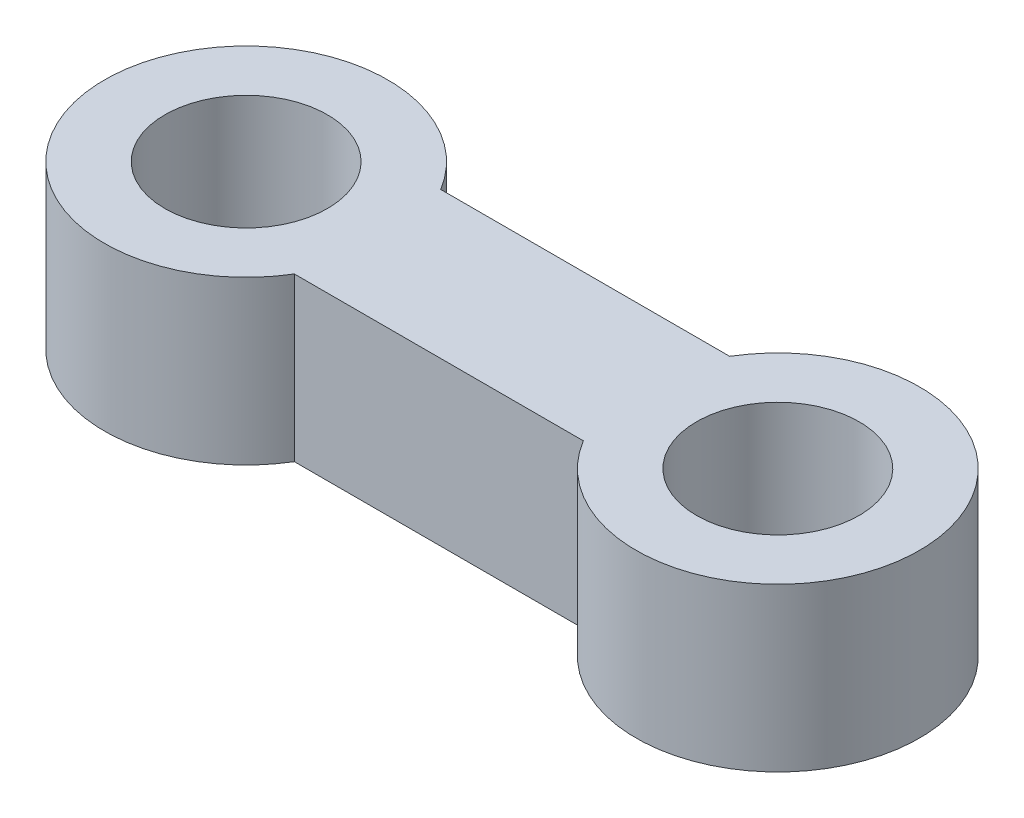
ISO-10303-21;
HEADER;
FILE_DESCRIPTION(('STEP AP214'),'2;1');
FILE_NAME('part.step','',(''),(''),'','','');
FILE_SCHEMA(('AUTOMOTIVE_DESIGN { 1 0 10303 214 1 1 1 1 }'));
ENDSEC;
DATA;
#1=APPLICATION_CONTEXT('core data for automotive mechanical design processes');
#2=APPLICATION_PROTOCOL_DEFINITION('international standard','automotive_design',2000,#1);
#3=PRODUCT_CONTEXT('',#1,'mechanical');
#4=PRODUCT('Part','Part','',(#3));
#5=PRODUCT_RELATED_PRODUCT_CATEGORY('part','',(#4));
#6=PRODUCT_DEFINITION_FORMATION('','',#4);
#7=PRODUCT_DEFINITION_CONTEXT('part definition',#1,'design');
#8=PRODUCT_DEFINITION('design','',#6,#7);
#9=PRODUCT_DEFINITION_SHAPE('','',#8);
#10=(LENGTH_UNIT() NAMED_UNIT(*) SI_UNIT(.MILLI.,.METRE.));
#11=(NAMED_UNIT(*) PLANE_ANGLE_UNIT() SI_UNIT($,.RADIAN.));
#12=(NAMED_UNIT(*) SI_UNIT($,.STERADIAN.) SOLID_ANGLE_UNIT());
#13=UNCERTAINTY_MEASURE_WITH_UNIT(LENGTH_MEASURE(1.E-05),#10,'distance_accuracy_value','');
#14=(GEOMETRIC_REPRESENTATION_CONTEXT(3) GLOBAL_UNCERTAINTY_ASSIGNED_CONTEXT((#13)) GLOBAL_UNIT_ASSIGNED_CONTEXT((#10,
#11,#12)) REPRESENTATION_CONTEXT('',''));
#15=CARTESIAN_POINT('',(0.,0.,0.));
#16=DIRECTION('',(0.,0.,1.));
#17=DIRECTION('',(1.,0.,0.));
#18=AXIS2_PLACEMENT_3D('',#15,#16,#17);
#19=CARTESIAN_POINT('',(-4.905,3.,0.));
#20=DIRECTION('',(0.,-1.,0.));
#21=DIRECTION('',(0.,0.,-1.));
#22=AXIS2_PLACEMENT_3D('',#19,#20,#21);
#23=CYLINDRICAL_SURFACE('',#22,2.61449275362319);
#24=CARTESIAN_POINT('',(-4.905,0.,0.));
#25=DIRECTION('',(0.,1.,0.));
#26=DIRECTION('',(0.,0.,1.));
#27=AXIS2_PLACEMENT_3D('',#24,#25,#26);
#28=CIRCLE('',#27,2.61449275362319);
#29=CARTESIAN_POINT('',(-2.66601086229786,0.,-1.35));
#30=VERTEX_POINT('',#29);
#31=CARTESIAN_POINT('',(-2.66601086229786,0.,1.35));
#32=VERTEX_POINT('',#31);
#33=EDGE_CURVE('E109',#30,#32,#28,.T.);
#34=ORIENTED_EDGE('',*,*,#33,.T.);
#35=DIRECTION('',(0.,1.,0.));
#36=VECTOR('',#35,1.);
#37=CARTESIAN_POINT('',(-2.66601086229786,0.,1.35));
#38=LINE('',#37,#36);
#39=CARTESIAN_POINT('',(-2.66601086229786,3.,1.35));
#40=VERTEX_POINT('',#39);
#41=EDGE_CURVE('E78',#32,#40,#38,.T.);
#42=ORIENTED_EDGE('',*,*,#41,.T.);
#43=CARTESIAN_POINT('',(-4.905,3.,0.));
#44=DIRECTION('',(0.,1.,0.));
#45=DIRECTION('',(0.,0.,1.));
#46=AXIS2_PLACEMENT_3D('',#43,#44,#45);
#47=CIRCLE('',#46,2.61449275362319);
#48=CARTESIAN_POINT('',(-2.66601086229786,3.,-1.35));
#49=VERTEX_POINT('',#48);
#50=EDGE_CURVE('E41',#49,#40,#47,.T.);
#51=ORIENTED_EDGE('',*,*,#50,.F.);
#52=DIRECTION('',(0.,1.,0.));
#53=VECTOR('',#52,1.);
#54=CARTESIAN_POINT('',(-2.66601086229786,0.,-1.35));
#55=LINE('',#54,#53);
#56=EDGE_CURVE('E75',#30,#49,#55,.T.);
#57=ORIENTED_EDGE('',*,*,#56,.F.);
#58=EDGE_LOOP('',(#34,#42,#51,#57));
#59=FACE_BOUND('',#58,.T.);
#60=ADVANCED_FACE('F33',(#59),#23,.T.);
#61=CARTESIAN_POINT('',(4.905,3.,0.));
#62=DIRECTION('',(0.,-1.,0.));
#63=DIRECTION('',(0.,0.,-1.));
#64=AXIS2_PLACEMENT_3D('',#61,#62,#63);
#65=CYLINDRICAL_SURFACE('',#64,2.61449275362319);
#66=CARTESIAN_POINT('',(4.905,0.,0.));
#67=DIRECTION('',(0.,1.,0.));
#68=DIRECTION('',(0.,0.,1.));
#69=AXIS2_PLACEMENT_3D('',#66,#67,#68);
#70=CIRCLE('',#69,2.61449275362319);
#71=CARTESIAN_POINT('',(2.66601086229786,0.,1.35));
#72=VERTEX_POINT('',#71);
#73=CARTESIAN_POINT('',(2.66601086229786,0.,-1.35));
#74=VERTEX_POINT('',#73);
#75=EDGE_CURVE('E36',#72,#74,#70,.T.);
#76=ORIENTED_EDGE('',*,*,#75,.T.);
#77=DIRECTION('',(0.,1.,0.));
#78=VECTOR('',#77,1.);
#79=CARTESIAN_POINT('',(2.66601086229786,0.,-1.35));
#80=LINE('',#79,#78);
#81=CARTESIAN_POINT('',(2.66601086229786,3.,-1.35));
#82=VERTEX_POINT('',#81);
#83=EDGE_CURVE('E89',#74,#82,#80,.T.);
#84=ORIENTED_EDGE('',*,*,#83,.T.);
#85=CARTESIAN_POINT('',(4.905,3.,0.));
#86=DIRECTION('',(0.,1.,0.));
#87=DIRECTION('',(0.,0.,1.));
#88=AXIS2_PLACEMENT_3D('',#85,#86,#87);
#89=CIRCLE('',#88,2.61449275362319);
#90=CARTESIAN_POINT('',(2.66601086229786,3.,1.35));
#91=VERTEX_POINT('',#90);
#92=EDGE_CURVE('E11',#91,#82,#89,.T.);
#93=ORIENTED_EDGE('',*,*,#92,.F.);
#94=DIRECTION('',(0.,1.,0.));
#95=VECTOR('',#94,1.);
#96=CARTESIAN_POINT('',(2.66601086229786,0.,1.35));
#97=LINE('',#96,#95);
#98=EDGE_CURVE('E95',#72,#91,#97,.T.);
#99=ORIENTED_EDGE('',*,*,#98,.F.);
#100=EDGE_LOOP('',(#76,#84,#93,#99));
#101=FACE_BOUND('',#100,.T.);
#102=ADVANCED_FACE('F135',(#101),#65,.T.);
#103=CARTESIAN_POINT('',(-4.905,3.,0.));
#104=DIRECTION('',(0.,1.,0.));
#105=DIRECTION('',(0.,0.,1.));
#106=AXIS2_PLACEMENT_3D('',#103,#104,#105);
#107=PLANE('',#106);
#108=DIRECTION('',(1.,0.,0.));
#109=VECTOR('',#108,1.);
#110=CARTESIAN_POINT('',(-2.66601086229786,3.,-1.35));
#111=LINE('',#110,#109);
#112=EDGE_CURVE('E87',#49,#82,#111,.T.);
#113=ORIENTED_EDGE('',*,*,#112,.F.);
#114=ORIENTED_EDGE('',*,*,#50,.T.);
#115=DIRECTION('',(-1.,0.,0.));
#116=VECTOR('',#115,1.);
#117=CARTESIAN_POINT('',(-2.66601086229786,3.,1.35));
#118=LINE('',#117,#116);
#119=EDGE_CURVE('E102',#91,#40,#118,.T.);
#120=ORIENTED_EDGE('',*,*,#119,.F.);
#121=ORIENTED_EDGE('',*,*,#92,.T.);
#122=EDGE_LOOP('',(#113,#114,#120,#121));
#123=FACE_BOUND('',#122,.T.);
#124=CARTESIAN_POINT('',(-4.905,3.,0.));
#125=DIRECTION('',(0.,1.,0.));
#126=DIRECTION('',(0.,0.,1.));
#127=AXIS2_PLACEMENT_3D('',#124,#125,#126);
#128=CIRCLE('',#127,1.5);
#129=CARTESIAN_POINT('',(-4.905,3.,1.5));
#130=VERTEX_POINT('',#129);
#131=EDGE_CURVE('E110',#130,#130,#128,.T.);
#132=ORIENTED_EDGE('',*,*,#131,.F.);
#133=EDGE_LOOP('',(#132));
#134=FACE_BOUND('',#133,.T.);
#135=CARTESIAN_POINT('',(4.905,3.,0.));
#136=DIRECTION('',(0.,1.,0.));
#137=DIRECTION('',(0.,0.,1.));
#138=AXIS2_PLACEMENT_3D('',#135,#136,#137);
#139=CIRCLE('',#138,1.5);
#140=CARTESIAN_POINT('',(4.905,3.,1.5));
#141=VERTEX_POINT('',#140);
#142=EDGE_CURVE('E98',#141,#141,#139,.T.);
#143=ORIENTED_EDGE('',*,*,#142,.F.);
#144=EDGE_LOOP('',(#143));
#145=FACE_BOUND('',#144,.T.);
#146=ADVANCED_FACE('F91',(#123,#134,#145),#107,.T.);
#147=CARTESIAN_POINT('',(-4.905,0.,0.));
#148=DIRECTION('',(0.,1.,0.));
#149=DIRECTION('',(0.,0.,1.));
#150=AXIS2_PLACEMENT_3D('',#147,#148,#149);
#151=PLANE('',#150);
#152=ORIENTED_EDGE('',*,*,#33,.F.);
#153=DIRECTION('',(1.,0.,0.));
#154=VECTOR('',#153,1.);
#155=CARTESIAN_POINT('',(-2.66601086229786,0.,-1.35));
#156=LINE('',#155,#154);
#157=EDGE_CURVE('E88',#30,#74,#156,.T.);
#158=ORIENTED_EDGE('',*,*,#157,.T.);
#159=ORIENTED_EDGE('',*,*,#75,.F.);
#160=DIRECTION('',(-1.,0.,0.));
#161=VECTOR('',#160,1.);
#162=CARTESIAN_POINT('',(-2.66601086229786,0.,1.35));
#163=LINE('',#162,#161);
#164=EDGE_CURVE('E100',#72,#32,#163,.T.);
#165=ORIENTED_EDGE('',*,*,#164,.T.);
#166=EDGE_LOOP('',(#152,#158,#159,#165));
#167=FACE_BOUND('',#166,.T.);
#168=CARTESIAN_POINT('',(-4.905,0.,0.));
#169=DIRECTION('',(0.,1.,0.));
#170=DIRECTION('',(0.,0.,1.));
#171=AXIS2_PLACEMENT_3D('',#168,#169,#170);
#172=CIRCLE('',#171,1.5);
#173=CARTESIAN_POINT('',(-4.905,0.,1.5));
#174=VERTEX_POINT('',#173);
#175=EDGE_CURVE('E106',#174,#174,#172,.T.);
#176=ORIENTED_EDGE('',*,*,#175,.T.);
#177=EDGE_LOOP('',(#176));
#178=FACE_BOUND('',#177,.T.);
#179=CARTESIAN_POINT('',(4.905,0.,0.));
#180=DIRECTION('',(0.,1.,0.));
#181=DIRECTION('',(0.,0.,1.));
#182=AXIS2_PLACEMENT_3D('',#179,#180,#181);
#183=CIRCLE('',#182,1.5);
#184=CARTESIAN_POINT('',(4.905,0.,1.5));
#185=VERTEX_POINT('',#184);
#186=EDGE_CURVE('E113',#185,#185,#183,.T.);
#187=ORIENTED_EDGE('',*,*,#186,.T.);
#188=EDGE_LOOP('',(#187));
#189=FACE_BOUND('',#188,.T.);
#190=ADVANCED_FACE('F119',(#167,#178,#189),#151,.F.);
#191=CARTESIAN_POINT('',(4.905,0.,0.));
#192=DIRECTION('',(0.,1.,0.));
#193=DIRECTION('',(0.,0.,1.));
#194=AXIS2_PLACEMENT_3D('',#191,#192,#193);
#195=CYLINDRICAL_SURFACE('',#194,1.5);
#196=ORIENTED_EDGE('',*,*,#186,.F.);
#197=EDGE_LOOP('',(#196));
#198=FACE_BOUND('',#197,.T.);
#199=ORIENTED_EDGE('',*,*,#142,.T.);
#200=EDGE_LOOP('',(#199));
#201=FACE_BOUND('',#200,.T.);
#202=ADVANCED_FACE('F122',(#198,#201),#195,.F.);
#203=CARTESIAN_POINT('',(-4.905,0.,0.));
#204=DIRECTION('',(0.,1.,0.));
#205=DIRECTION('',(0.,0.,1.));
#206=AXIS2_PLACEMENT_3D('',#203,#204,#205);
#207=CYLINDRICAL_SURFACE('',#206,1.5);
#208=ORIENTED_EDGE('',*,*,#175,.F.);
#209=EDGE_LOOP('',(#208));
#210=FACE_BOUND('',#209,.T.);
#211=ORIENTED_EDGE('',*,*,#131,.T.);
#212=EDGE_LOOP('',(#211));
#213=FACE_BOUND('',#212,.T.);
#214=ADVANCED_FACE('F130',(#210,#213),#207,.F.);
#215=CARTESIAN_POINT('',(-2.66601086229786,0.,1.35));
#216=DIRECTION('',(0.,0.,-1.));
#217=DIRECTION('',(-1.,0.,0.));
#218=AXIS2_PLACEMENT_3D('',#215,#216,#217);
#219=PLANE('',#218);
#220=ORIENTED_EDGE('',*,*,#119,.T.);
#221=ORIENTED_EDGE('',*,*,#41,.F.);
#222=ORIENTED_EDGE('',*,*,#164,.F.);
#223=ORIENTED_EDGE('',*,*,#98,.T.);
#224=EDGE_LOOP('',(#220,#221,#222,#223));
#225=FACE_BOUND('',#224,.T.);
#226=ADVANCED_FACE('F118',(#225),#219,.F.);
#227=CARTESIAN_POINT('',(-2.66601086229786,0.,-1.35));
#228=DIRECTION('',(0.,0.,1.));
#229=DIRECTION('',(1.,0.,0.));
#230=AXIS2_PLACEMENT_3D('',#227,#228,#229);
#231=PLANE('',#230);
#232=ORIENTED_EDGE('',*,*,#112,.T.);
#233=ORIENTED_EDGE('',*,*,#83,.F.);
#234=ORIENTED_EDGE('',*,*,#157,.F.);
#235=ORIENTED_EDGE('',*,*,#56,.T.);
#236=EDGE_LOOP('',(#232,#233,#234,#235));
#237=FACE_BOUND('',#236,.T.);
#238=ADVANCED_FACE('F86',(#237),#231,.F.);
#239=CLOSED_SHELL('',(#60,#102,#146,#190,#202,#214,#226,#238));
#240=MANIFOLD_SOLID_BREP('B2',#239);
#241=ADVANCED_BREP_SHAPE_REPRESENTATION('',(#18,#240),#14);
#242=SHAPE_DEFINITION_REPRESENTATION(#9,#241);
ENDSEC;
END-ISO-10303-21;
